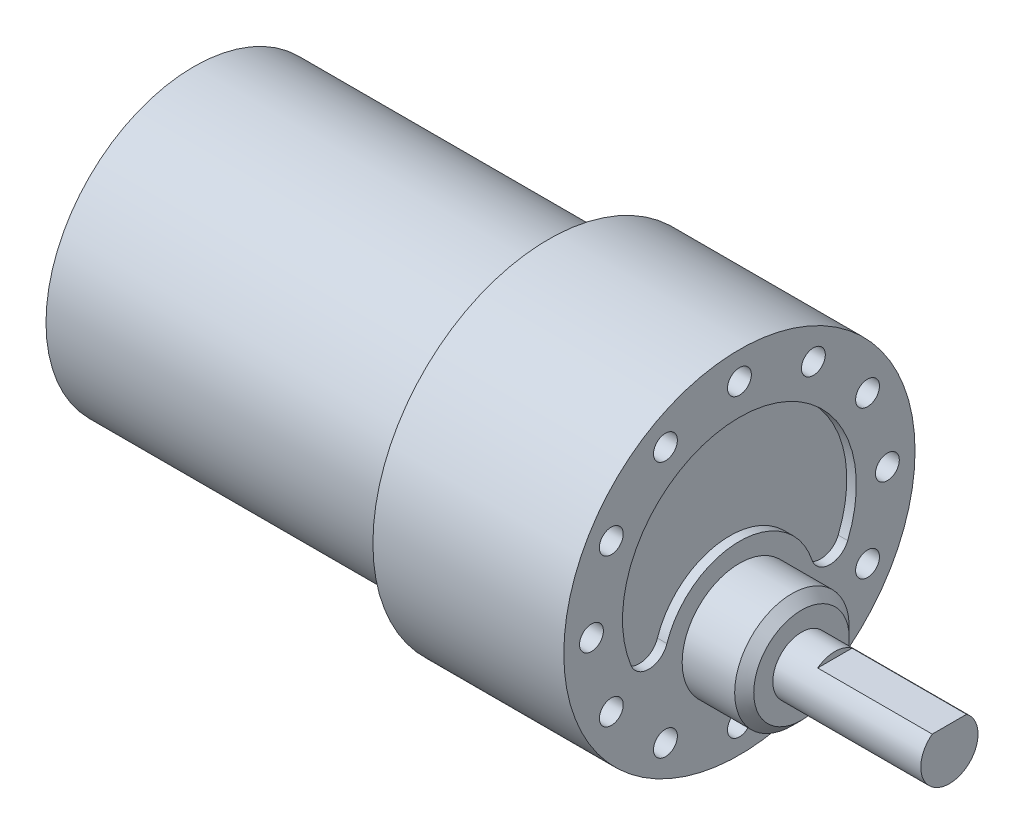
ISO-10303-21;
HEADER;
FILE_DESCRIPTION(('STEP AP214'),'2;1');
FILE_NAME('part.step','',(''),(''),'','','');
FILE_SCHEMA(('AUTOMOTIVE_DESIGN { 1 0 10303 214 1 1 1 1 }'));
ENDSEC;
DATA;
#1=APPLICATION_CONTEXT('core data for automotive mechanical design processes');
#2=APPLICATION_PROTOCOL_DEFINITION('international standard','automotive_design',2000,#1);
#3=PRODUCT_CONTEXT('',#1,'mechanical');
#4=PRODUCT('Part','Part','',(#3));
#5=PRODUCT_RELATED_PRODUCT_CATEGORY('part','',(#4));
#6=PRODUCT_DEFINITION_FORMATION('','',#4);
#7=PRODUCT_DEFINITION_CONTEXT('part definition',#1,'design');
#8=PRODUCT_DEFINITION('design','',#6,#7);
#9=PRODUCT_DEFINITION_SHAPE('','',#8);
#10=(LENGTH_UNIT() NAMED_UNIT(*) SI_UNIT(.MILLI.,.METRE.));
#11=(NAMED_UNIT(*) PLANE_ANGLE_UNIT() SI_UNIT($,.RADIAN.));
#12=(NAMED_UNIT(*) SI_UNIT($,.STERADIAN.) SOLID_ANGLE_UNIT());
#13=UNCERTAINTY_MEASURE_WITH_UNIT(LENGTH_MEASURE(1.E-05),#10,'distance_accuracy_value','');
#14=(GEOMETRIC_REPRESENTATION_CONTEXT(3) GLOBAL_UNCERTAINTY_ASSIGNED_CONTEXT((#13)) GLOBAL_UNIT_ASSIGNED_CONTEXT((#10,
#11,#12)) REPRESENTATION_CONTEXT('',''));
#15=CARTESIAN_POINT('',(0.,0.,0.));
#16=DIRECTION('',(0.,0.,1.));
#17=DIRECTION('',(1.,0.,0.));
#18=AXIS2_PLACEMENT_3D('',#15,#16,#17);
#19=CARTESIAN_POINT('',(6.5,-7.,0.));
#20=DIRECTION('',(-1.,0.,0.));
#21=DIRECTION('',(0.,0.,1.));
#22=AXIS2_PLACEMENT_3D('',#19,#20,#21);
#23=CYLINDRICAL_SURFACE('',#22,6.);
#24=CARTESIAN_POINT('',(5.50000000000004,-7.,0.));
#25=DIRECTION('',(1.,0.,0.));
#26=DIRECTION('',(0.,0.,-1.));
#27=AXIS2_PLACEMENT_3D('',#24,#25,#26);
#28=CIRCLE('',#27,6.);
#29=CARTESIAN_POINT('',(5.50000000000004,-7.,6.));
#30=VERTEX_POINT('',#29);
#31=EDGE_CURVE('E11',#30,#30,#28,.F.);
#32=CARTESIAN_POINT('',(0.,-7.,0.));
#33=DIRECTION('',(1.,0.,0.));
#34=DIRECTION('',(0.,0.,-1.));
#35=AXIS2_PLACEMENT_3D('',#32,#33,#34);
#36=CIRCLE('',#35,6.);
#37=CARTESIAN_POINT('',(0.,-7.,6.));
#38=VERTEX_POINT('',#37);
#39=EDGE_CURVE('E259',#38,#38,#36,.T.);
#40=CARTESIAN_POINT('',(5.50000000000004,-7.,6.));
#41=CARTESIAN_POINT('',(5.44270833333337,-7.,6.));
#42=CARTESIAN_POINT('',(5.3854166666667,-7.,6.));
#43=CARTESIAN_POINT('',(5.27083333333337,-7.,6.));
#44=CARTESIAN_POINT('',(5.2135416666667,-7.,6.));
#45=CARTESIAN_POINT('',(5.09895833333337,-7.,6.));
#46=CARTESIAN_POINT('',(5.0416666666667,-7.,6.));
#47=CARTESIAN_POINT('',(4.92708333333337,-7.,6.));
#48=CARTESIAN_POINT('',(4.8697916666667,-7.,6.));
#49=CARTESIAN_POINT('',(4.75520833333336,-7.,6.));
#50=CARTESIAN_POINT('',(4.6979166666667,-7.,6.));
#51=CARTESIAN_POINT('',(4.58333333333336,-7.,6.));
#52=CARTESIAN_POINT('',(4.5260416666667,-7.,6.));
#53=CARTESIAN_POINT('',(4.41145833333336,-7.,6.));
#54=CARTESIAN_POINT('',(4.35416666666669,-7.,6.));
#55=CARTESIAN_POINT('',(4.23958333333336,-7.,6.));
#56=CARTESIAN_POINT('',(4.18229166666669,-7.,6.));
#57=CARTESIAN_POINT('',(4.06770833333336,-7.,6.));
#58=CARTESIAN_POINT('',(4.01041666666669,-7.,6.));
#59=CARTESIAN_POINT('',(3.89583333333336,-7.,6.));
#60=CARTESIAN_POINT('',(3.83854166666669,-7.,6.));
#61=CARTESIAN_POINT('',(3.72395833333336,-7.,6.));
#62=CARTESIAN_POINT('',(3.66666666666669,-7.,6.));
#63=CARTESIAN_POINT('',(3.55208333333336,-7.,6.));
#64=CARTESIAN_POINT('',(3.49479166666669,-7.,6.));
#65=CARTESIAN_POINT('',(3.38020833333336,-7.,6.));
#66=CARTESIAN_POINT('',(3.32291666666669,-7.,6.));
#67=CARTESIAN_POINT('',(3.20833333333335,-7.,6.));
#68=CARTESIAN_POINT('',(3.15104166666669,-7.,6.));
#69=CARTESIAN_POINT('',(3.03645833333335,-7.,6.));
#70=CARTESIAN_POINT('',(2.97916666666669,-7.,6.));
#71=CARTESIAN_POINT('',(2.86458333333335,-7.,6.));
#72=CARTESIAN_POINT('',(2.80729166666668,-7.,6.));
#73=CARTESIAN_POINT('',(2.69270833333335,-7.,6.));
#74=CARTESIAN_POINT('',(2.63541666666668,-7.,6.));
#75=CARTESIAN_POINT('',(2.52083333333335,-7.,6.));
#76=CARTESIAN_POINT('',(2.46354166666668,-7.,6.));
#77=CARTESIAN_POINT('',(2.34895833333335,-7.,6.));
#78=CARTESIAN_POINT('',(2.29166666666668,-7.,6.));
#79=CARTESIAN_POINT('',(2.17708333333335,-7.,6.));
#80=CARTESIAN_POINT('',(2.11979166666668,-7.,6.));
#81=CARTESIAN_POINT('',(2.00520833333335,-7.,6.));
#82=CARTESIAN_POINT('',(1.94791666666668,-7.,6.));
#83=CARTESIAN_POINT('',(1.83333333333335,-7.,6.));
#84=CARTESIAN_POINT('',(1.77604166666668,-7.,6.));
#85=CARTESIAN_POINT('',(1.66145833333334,-7.,6.));
#86=CARTESIAN_POINT('',(1.60416666666668,-7.,6.));
#87=CARTESIAN_POINT('',(1.48958333333334,-7.,6.));
#88=CARTESIAN_POINT('',(1.43229166666668,-7.,6.));
#89=CARTESIAN_POINT('',(1.31770833333334,-7.,6.));
#90=CARTESIAN_POINT('',(1.26041666666668,-7.,6.));
#91=CARTESIAN_POINT('',(1.14583333333334,-7.,6.));
#92=CARTESIAN_POINT('',(1.08854166666667,-7.,6.));
#93=CARTESIAN_POINT('',(0.97395833333334,-7.,6.));
#94=CARTESIAN_POINT('',(0.916666666666673,-7.,6.));
#95=CARTESIAN_POINT('',(0.802083333333339,-7.,6.));
#96=CARTESIAN_POINT('',(0.744791666666671,-7.,6.));
#97=CARTESIAN_POINT('',(0.630208333333337,-7.,6.));
#98=CARTESIAN_POINT('',(0.57291666666667,-7.,6.));
#99=CARTESIAN_POINT('',(0.458333333333336,-7.,6.));
#100=CARTESIAN_POINT('',(0.401041666666669,-7.,6.));
#101=CARTESIAN_POINT('',(0.286458333333335,-7.,6.));
#102=CARTESIAN_POINT('',(0.229166666666668,-7.,6.));
#103=CARTESIAN_POINT('',(0.114583333333334,-7.,6.));
#104=CARTESIAN_POINT('',(0.057291666666667,-7.,6.));
#105=CARTESIAN_POINT('',(0.,-7.,6.));
#106=B_SPLINE_CURVE_WITH_KNOTS('',3,(#40,#41,#42,#43,#44,#45,#46,#47,#48,#49,#50,#51,#52,#53,
#54,#55,#56,#57,#58,#59,#60,#61,#62,#63,#64,#65,#66,#67,#68,#69,#70,#71,#72,#73,#74,#75,#76,#77,
#78,#79,#80,#81,#82,#83,#84,#85,#86,#87,#88,#89,#90,#91,#92,#93,#94,#95,#96,#97,#98,#99,#100,
#101,#102,#103,#104,#105),.UNSPECIFIED.,.F.,.F.,(4,2,2,2,2,2,2,2,2,2,2,2,2,2,2,2,2,2,2,2,2,2,2,
2,2,2,2,2,2,2,2,2,4),(0.,0.171875000000001,0.343750000000002,0.515625000000003,
0.687500000000004,0.859375000000005,1.03125000000001,1.20312500000001,1.37500000000001,
1.54687500000001,1.71875000000001,1.89062500000001,2.06250000000001,2.23437500000001,
2.40625000000002,2.57812500000002,2.75000000000002,2.92187500000002,3.09375000000002,
3.26562500000002,3.43750000000002,3.60937500000002,3.78125000000002,3.95312500000003,
4.12500000000003,4.29687500000003,4.46875000000003,4.64062500000003,4.81250000000003,
4.98437500000003,5.15625000000003,5.32812500000003,5.50000000000004),.UNSPECIFIED.);
#107=EDGE_CURVE('BSEAM38',#30,#38,#106,.T.);
#108=ORIENTED_EDGE('',*,*,#31,.T.);
#109=ORIENTED_EDGE('',*,*,#39,.T.);
#110=ORIENTED_EDGE('',*,*,#107,.T.);
#111=ORIENTED_EDGE('',*,*,#107,.F.);
#112=EDGE_LOOP('',(#108,#110,#109,#111));
#113=FACE_BOUND('',#112,.T.);
#114=ADVANCED_FACE('F38',(#113),#23,.T.);
#115=CARTESIAN_POINT('',(6.5,0.,0.));
#116=DIRECTION('',(1.,0.,0.));
#117=DIRECTION('',(0.,0.,-1.));
#118=AXIS2_PLACEMENT_3D('',#115,#116,#117);
#119=PLANE('',#118);
#120=CARTESIAN_POINT('',(6.5,-7.,0.));
#121=DIRECTION('',(1.,0.,0.));
#122=DIRECTION('',(0.,0.,-1.));
#123=AXIS2_PLACEMENT_3D('',#120,#121,#122);
#124=CIRCLE('',#123,5.00000000000005);
#125=CARTESIAN_POINT('',(6.5,-7.,-5.00000000000005));
#126=VERTEX_POINT('',#125);
#127=EDGE_CURVE('E46',#126,#126,#124,.T.);
#128=ORIENTED_EDGE('',*,*,#127,.T.);
#129=EDGE_LOOP('',(#128));
#130=FACE_BOUND('',#129,.T.);
#131=CARTESIAN_POINT('',(6.5,-7.,0.));
#132=DIRECTION('',(1.,0.,0.));
#133=DIRECTION('',(0.,0.,-1.));
#134=AXIS2_PLACEMENT_3D('',#131,#132,#133);
#135=CIRCLE('',#134,3.);
#136=CARTESIAN_POINT('',(6.5,-7.,-3.));
#137=VERTEX_POINT('',#136);
#138=EDGE_CURVE('E263',#137,#137,#135,.T.);
#139=ORIENTED_EDGE('',*,*,#138,.F.);
#140=EDGE_LOOP('',(#139));
#141=FACE_BOUND('',#140,.T.);
#142=ADVANCED_FACE('F270',(#130,#141),#119,.T.);
#143=CARTESIAN_POINT('',(22.,-7.,0.));
#144=DIRECTION('',(-1.,0.,0.));
#145=DIRECTION('',(0.,0.,1.));
#146=AXIS2_PLACEMENT_3D('',#143,#144,#145);
#147=CYLINDRICAL_SURFACE('',#146,3.);
#148=CARTESIAN_POINT('',(22.,-7.,0.));
#149=DIRECTION('',(1.,0.,0.));
#150=DIRECTION('',(0.,0.,-1.));
#151=AXIS2_PLACEMENT_3D('',#148,#149,#150);
#152=CIRCLE('',#151,3.);
#153=CARTESIAN_POINT('',(22.,-4.6,1.8));
#154=VERTEX_POINT('',#153);
#155=CARTESIAN_POINT('',(22.,-4.6,-1.8));
#156=VERTEX_POINT('',#155);
#157=EDGE_CURVE('E142',#154,#156,#152,.T.);
#158=ORIENTED_EDGE('',*,*,#157,.F.);
#159=DIRECTION('',(1.,0.,0.));
#160=VECTOR('',#159,1.);
#161=CARTESIAN_POINT('',(10.,-4.6,1.8));
#162=LINE('',#161,#160);
#163=CARTESIAN_POINT('',(10.,-4.6,1.8));
#164=VERTEX_POINT('',#163);
#165=EDGE_CURVE('E53',#164,#154,#162,.T.);
#166=ORIENTED_EDGE('',*,*,#165,.F.);
#167=CARTESIAN_POINT('',(10.,-7.,0.));
#168=DIRECTION('',(1.,0.,0.));
#169=DIRECTION('',(0.,0.,-1.));
#170=AXIS2_PLACEMENT_3D('',#167,#168,#169);
#171=CIRCLE('',#170,3.);
#172=CARTESIAN_POINT('',(10.,-4.6,-1.8));
#173=VERTEX_POINT('',#172);
#174=EDGE_CURVE('E128',#173,#164,#171,.T.);
#175=ORIENTED_EDGE('',*,*,#174,.F.);
#176=DIRECTION('',(1.,0.,0.));
#177=VECTOR('',#176,1.);
#178=CARTESIAN_POINT('',(10.,-4.6,-1.8));
#179=LINE('',#178,#177);
#180=EDGE_CURVE('E136',#173,#156,#179,.T.);
#181=ORIENTED_EDGE('',*,*,#180,.T.);
#182=EDGE_LOOP('',(#158,#166,#175,#181));
#183=FACE_BOUND('',#182,.T.);
#184=ORIENTED_EDGE('',*,*,#138,.T.);
#185=EDGE_LOOP('',(#184));
#186=FACE_BOUND('',#185,.T.);
#187=ADVANCED_FACE('F139',(#183,#186),#147,.T.);
#188=CARTESIAN_POINT('',(22.,0.,0.));
#189=DIRECTION('',(1.,0.,0.));
#190=DIRECTION('',(0.,0.,-1.));
#191=AXIS2_PLACEMENT_3D('',#188,#189,#190);
#192=PLANE('',#191);
#193=DIRECTION('',(0.,0.,-1.));
#194=VECTOR('',#193,1.);
#195=CARTESIAN_POINT('',(22.,-4.6,1.8));
#196=LINE('',#195,#194);
#197=EDGE_CURVE('E133',#154,#156,#196,.T.);
#198=ORIENTED_EDGE('',*,*,#197,.F.);
#199=ORIENTED_EDGE('',*,*,#157,.T.);
#200=EDGE_LOOP('',(#198,#199));
#201=FACE_BOUND('',#200,.T.);
#202=ADVANCED_FACE('F290',(#201),#192,.T.);
#203=CARTESIAN_POINT('',(0.,0.,0.));
#204=DIRECTION('',(1.,0.,0.));
#205=DIRECTION('',(0.,0.,-1.));
#206=AXIS2_PLACEMENT_3D('',#203,#204,#205);
#207=PLANE('',#206);
#208=CARTESIAN_POINT('',(0.,-3.86160714285714,9.49476120153818));
#209=DIRECTION('',(1.,0.,0.));
#210=DIRECTION('',(0.,0.,1.));
#211=AXIS2_PLACEMENT_3D('',#208,#209,#210);
#212=CIRCLE('',#211,2.);
#213=CARTESIAN_POINT('',(0.,-4.61509146341463,11.3473975335456));
#214=VERTEX_POINT('',#213);
#215=CARTESIAN_POINT('',(0.,-4.48928571428572,7.59580896123054));
#216=VERTEX_POINT('',#215);
#217=EDGE_CURVE('E61',#214,#216,#212,.T.);
#218=ORIENTED_EDGE('',*,*,#217,.F.);
#219=CARTESIAN_POINT('',(0.,0.,0.));
#220=DIRECTION('',(1.,0.,0.));
#221=DIRECTION('',(0.,0.,-1.));
#222=AXIS2_PLACEMENT_3D('',#219,#220,#221);
#223=CIRCLE('',#222,12.25);
#224=CARTESIAN_POINT('',(0.,-4.61509146341463,-11.3473975335456));
#225=VERTEX_POINT('',#224);
#226=EDGE_CURVE('E151',#225,#214,#223,.T.);
#227=ORIENTED_EDGE('',*,*,#226,.F.);
#228=CARTESIAN_POINT('',(0.,-3.86160714285714,-9.49476120153818));
#229=DIRECTION('',(1.,0.,0.));
#230=DIRECTION('',(0.,0.,-1.));
#231=AXIS2_PLACEMENT_3D('',#228,#229,#230);
#232=CIRCLE('',#231,2.);
#233=CARTESIAN_POINT('',(0.,-4.48928571428571,-7.59580896123054));
#234=VERTEX_POINT('',#233);
#235=EDGE_CURVE('E165',#234,#225,#232,.T.);
#236=ORIENTED_EDGE('',*,*,#235,.F.);
#237=CARTESIAN_POINT('',(0.,-7.,0.));
#238=DIRECTION('',(-1.,0.,0.));
#239=DIRECTION('',(0.,0.,-1.));
#240=AXIS2_PLACEMENT_3D('',#237,#238,#239);
#241=CIRCLE('',#240,8.);
#242=EDGE_CURVE('E162',#216,#234,#241,.T.);
#243=ORIENTED_EDGE('',*,*,#242,.F.);
#244=EDGE_LOOP('',(#218,#227,#236,#243));
#245=FACE_BOUND('',#244,.T.);
#246=CARTESIAN_POINT('',(0.,7.75000000000006,13.4233937586588));
#247=DIRECTION('',(1.,0.,0.));
#248=DIRECTION('',(0.,0.,-1.));
#249=AXIS2_PLACEMENT_3D('',#246,#247,#248);
#250=CIRCLE('',#249,1.25);
#251=CARTESIAN_POINT('',(0.,7.75000000000006,12.1733937586588));
#252=VERTEX_POINT('',#251);
#253=EDGE_CURVE('E172',#252,#252,#250,.T.);
#254=ORIENTED_EDGE('',*,*,#253,.F.);
#255=EDGE_LOOP('',(#254));
#256=FACE_BOUND('',#255,.T.);
#257=CARTESIAN_POINT('',(0.,0.,15.5));
#258=DIRECTION('',(1.,0.,0.));
#259=DIRECTION('',(0.,0.,-1.));
#260=AXIS2_PLACEMENT_3D('',#257,#258,#259);
#261=CIRCLE('',#260,1.25);
#262=CARTESIAN_POINT('',(0.,0.,14.25));
#263=VERTEX_POINT('',#262);
#264=EDGE_CURVE('E183',#263,#263,#261,.T.);
#265=ORIENTED_EDGE('',*,*,#264,.F.);
#266=EDGE_LOOP('',(#265));
#267=FACE_BOUND('',#266,.T.);
#268=CARTESIAN_POINT('',(0.,-7.75000000000006,13.4233937586588));
#269=DIRECTION('',(1.,0.,0.));
#270=DIRECTION('',(0.,0.,-1.));
#271=AXIS2_PLACEMENT_3D('',#268,#269,#270);
#272=CIRCLE('',#271,1.25);
#273=CARTESIAN_POINT('',(0.,-7.75000000000006,12.1733937586588));
#274=VERTEX_POINT('',#273);
#275=EDGE_CURVE('E189',#274,#274,#272,.T.);
#276=ORIENTED_EDGE('',*,*,#275,.F.);
#277=EDGE_LOOP('',(#276));
#278=FACE_BOUND('',#277,.T.);
#279=CARTESIAN_POINT('',(0.,-13.4233937586588,7.75));
#280=DIRECTION('',(1.,0.,0.));
#281=DIRECTION('',(0.,0.,-1.));
#282=AXIS2_PLACEMENT_3D('',#279,#280,#281);
#283=CIRCLE('',#282,1.25);
#284=CARTESIAN_POINT('',(0.,-13.4233937586588,6.5));
#285=VERTEX_POINT('',#284);
#286=EDGE_CURVE('E195',#285,#285,#283,.T.);
#287=ORIENTED_EDGE('',*,*,#286,.F.);
#288=EDGE_LOOP('',(#287));
#289=FACE_BOUND('',#288,.T.);
#290=CARTESIAN_POINT('',(0.,-15.5,0.));
#291=DIRECTION('',(1.,0.,0.));
#292=DIRECTION('',(0.,0.,-1.));
#293=AXIS2_PLACEMENT_3D('',#290,#291,#292);
#294=CIRCLE('',#293,1.25);
#295=CARTESIAN_POINT('',(0.,-15.5,-1.25));
#296=VERTEX_POINT('',#295);
#297=EDGE_CURVE('E201',#296,#296,#294,.T.);
#298=ORIENTED_EDGE('',*,*,#297,.F.);
#299=EDGE_LOOP('',(#298));
#300=FACE_BOUND('',#299,.T.);
#301=CARTESIAN_POINT('',(0.,-13.4233937586588,-7.75));
#302=DIRECTION('',(1.,0.,0.));
#303=DIRECTION('',(0.,0.,-1.));
#304=AXIS2_PLACEMENT_3D('',#301,#302,#303);
#305=CIRCLE('',#304,1.25);
#306=CARTESIAN_POINT('',(0.,-13.4233937586588,-9.));
#307=VERTEX_POINT('',#306);
#308=EDGE_CURVE('E207',#307,#307,#305,.T.);
#309=ORIENTED_EDGE('',*,*,#308,.F.);
#310=EDGE_LOOP('',(#309));
#311=FACE_BOUND('',#310,.T.);
#312=CARTESIAN_POINT('',(0.,-7.75000000000007,-13.4233937586588));
#313=DIRECTION('',(1.,0.,0.));
#314=DIRECTION('',(0.,0.,-1.));
#315=AXIS2_PLACEMENT_3D('',#312,#313,#314);
#316=CIRCLE('',#315,1.25);
#317=CARTESIAN_POINT('',(0.,-7.75000000000007,-14.6733937586588));
#318=VERTEX_POINT('',#317);
#319=EDGE_CURVE('E213',#318,#318,#316,.T.);
#320=ORIENTED_EDGE('',*,*,#319,.F.);
#321=EDGE_LOOP('',(#320));
#322=FACE_BOUND('',#321,.T.);
#323=CARTESIAN_POINT('',(0.,0.,-15.5));
#324=DIRECTION('',(1.,0.,0.));
#325=DIRECTION('',(0.,0.,-1.));
#326=AXIS2_PLACEMENT_3D('',#323,#324,#325);
#327=CIRCLE('',#326,1.25);
#328=CARTESIAN_POINT('',(0.,0.,-16.75));
#329=VERTEX_POINT('',#328);
#330=EDGE_CURVE('E219',#329,#329,#327,.T.);
#331=ORIENTED_EDGE('',*,*,#330,.F.);
#332=EDGE_LOOP('',(#331));
#333=FACE_BOUND('',#332,.T.);
#334=CARTESIAN_POINT('',(0.,7.75000000000007,-13.4233937586588));
#335=DIRECTION('',(1.,0.,0.));
#336=DIRECTION('',(0.,0.,-1.));
#337=AXIS2_PLACEMENT_3D('',#334,#335,#336);
#338=CIRCLE('',#337,1.25);
#339=CARTESIAN_POINT('',(0.,7.75000000000007,-14.6733937586588));
#340=VERTEX_POINT('',#339);
#341=EDGE_CURVE('E225',#340,#340,#338,.T.);
#342=ORIENTED_EDGE('',*,*,#341,.F.);
#343=EDGE_LOOP('',(#342));
#344=FACE_BOUND('',#343,.T.);
#345=CARTESIAN_POINT('',(0.,13.4233937586588,-7.75));
#346=DIRECTION('',(1.,0.,0.));
#347=DIRECTION('',(0.,0.,-1.));
#348=AXIS2_PLACEMENT_3D('',#345,#346,#347);
#349=CIRCLE('',#348,1.25);
#350=CARTESIAN_POINT('',(0.,13.4233937586588,-9.));
#351=VERTEX_POINT('',#350);
#352=EDGE_CURVE('E231',#351,#351,#349,.T.);
#353=ORIENTED_EDGE('',*,*,#352,.F.);
#354=EDGE_LOOP('',(#353));
#355=FACE_BOUND('',#354,.T.);
#356=CARTESIAN_POINT('',(0.,15.5,0.));
#357=DIRECTION('',(1.,0.,0.));
#358=DIRECTION('',(0.,0.,-1.));
#359=AXIS2_PLACEMENT_3D('',#356,#357,#358);
#360=CIRCLE('',#359,1.25);
#361=CARTESIAN_POINT('',(0.,15.5,-1.25));
#362=VERTEX_POINT('',#361);
#363=EDGE_CURVE('E237',#362,#362,#360,.T.);
#364=ORIENTED_EDGE('',*,*,#363,.F.);
#365=EDGE_LOOP('',(#364));
#366=FACE_BOUND('',#365,.T.);
#367=CARTESIAN_POINT('',(0.,13.4233937586588,7.75));
#368=DIRECTION('',(1.,0.,0.));
#369=DIRECTION('',(0.,0.,-1.));
#370=AXIS2_PLACEMENT_3D('',#367,#368,#369);
#371=CIRCLE('',#370,1.25);
#372=CARTESIAN_POINT('',(0.,13.4233937586588,6.5));
#373=VERTEX_POINT('',#372);
#374=EDGE_CURVE('E243',#373,#373,#371,.T.);
#375=ORIENTED_EDGE('',*,*,#374,.F.);
#376=EDGE_LOOP('',(#375));
#377=FACE_BOUND('',#376,.T.);
#378=ORIENTED_EDGE('',*,*,#39,.F.);
#379=EDGE_LOOP('',(#378));
#380=FACE_BOUND('',#379,.T.);
#381=CARTESIAN_POINT('',(0.,0.,0.));
#382=DIRECTION('',(1.,0.,0.));
#383=DIRECTION('',(0.,0.,-1.));
#384=AXIS2_PLACEMENT_3D('',#381,#382,#383);
#385=CIRCLE('',#384,18.4);
#386=CARTESIAN_POINT('',(0.,0.,-18.4));
#387=VERTEX_POINT('',#386);
#388=EDGE_CURVE('E249',#387,#387,#385,.T.);
#389=ORIENTED_EDGE('',*,*,#388,.T.);
#390=EDGE_LOOP('',(#389));
#391=FACE_BOUND('',#390,.T.);
#392=ADVANCED_FACE('F293',(#245,#256,#267,#278,#289,#300,#311,#322,#333,#344,#355,#366,#377,
#380,#391),#207,.T.);
#393=CARTESIAN_POINT('',(-20.,0.,0.));
#394=DIRECTION('',(1.,0.,0.));
#395=DIRECTION('',(0.,0.,-1.));
#396=AXIS2_PLACEMENT_3D('',#393,#394,#395);
#397=CYLINDRICAL_SURFACE('',#396,18.4);
#398=CARTESIAN_POINT('',(-20.,0.,0.));
#399=DIRECTION('',(1.,0.,0.));
#400=DIRECTION('',(0.,0.,-1.));
#401=AXIS2_PLACEMENT_3D('',#398,#399,#400);
#402=CIRCLE('',#401,18.4);
#403=CARTESIAN_POINT('',(-20.,0.,-18.4));
#404=VERTEX_POINT('',#403);
#405=EDGE_CURVE('E250',#404,#404,#402,.T.);
#406=ORIENTED_EDGE('',*,*,#405,.T.);
#407=EDGE_LOOP('',(#406));
#408=FACE_BOUND('',#407,.T.);
#409=ORIENTED_EDGE('',*,*,#388,.F.);
#410=EDGE_LOOP('',(#409));
#411=FACE_BOUND('',#410,.T.);
#412=ADVANCED_FACE('F303',(#408,#411),#397,.T.);
#413=CARTESIAN_POINT('',(-20.,0.,0.));
#414=DIRECTION('',(1.,0.,0.));
#415=DIRECTION('',(0.,0.,-1.));
#416=AXIS2_PLACEMENT_3D('',#413,#414,#415);
#417=PLANE('',#416);
#418=CARTESIAN_POINT('',(-20.,0.,0.));
#419=DIRECTION('',(1.,0.,0.));
#420=DIRECTION('',(0.,0.,-1.));
#421=AXIS2_PLACEMENT_3D('',#418,#419,#420);
#422=CIRCLE('',#421,15.5);
#423=CARTESIAN_POINT('',(-20.,0.,-15.5));
#424=VERTEX_POINT('',#423);
#425=EDGE_CURVE('E253',#424,#424,#422,.F.);
#426=ORIENTED_EDGE('',*,*,#425,.F.);
#427=EDGE_LOOP('',(#426));
#428=FACE_BOUND('',#427,.T.);
#429=ORIENTED_EDGE('',*,*,#405,.F.);
#430=EDGE_LOOP('',(#429));
#431=FACE_BOUND('',#430,.T.);
#432=ADVANCED_FACE('F307',(#428,#431),#417,.F.);
#433=CARTESIAN_POINT('',(-57.15,0.,0.));
#434=DIRECTION('',(1.,0.,0.));
#435=DIRECTION('',(0.,0.,-1.));
#436=AXIS2_PLACEMENT_3D('',#433,#434,#435);
#437=PLANE('',#436);
#438=CARTESIAN_POINT('',(-57.15,0.,0.));
#439=DIRECTION('',(1.,0.,0.));
#440=DIRECTION('',(0.,0.,-1.));
#441=AXIS2_PLACEMENT_3D('',#438,#439,#440);
#442=CIRCLE('',#441,15.5);
#443=CARTESIAN_POINT('',(-57.15,0.,-15.5));
#444=VERTEX_POINT('',#443);
#445=EDGE_CURVE('E256',#444,#444,#442,.T.);
#446=ORIENTED_EDGE('',*,*,#445,.F.);
#447=EDGE_LOOP('',(#446));
#448=FACE_BOUND('',#447,.T.);
#449=ADVANCED_FACE('F299',(#448),#437,.F.);
#450=CARTESIAN_POINT('',(-57.15,0.,0.));
#451=DIRECTION('',(1.,0.,0.));
#452=DIRECTION('',(0.,0.,-1.));
#453=AXIS2_PLACEMENT_3D('',#450,#451,#452);
#454=CYLINDRICAL_SURFACE('',#453,15.5);
#455=ORIENTED_EDGE('',*,*,#445,.T.);
#456=EDGE_LOOP('',(#455));
#457=FACE_BOUND('',#456,.T.);
#458=ORIENTED_EDGE('',*,*,#425,.T.);
#459=EDGE_LOOP('',(#458));
#460=FACE_BOUND('',#459,.T.);
#461=ADVANCED_FACE('F295',(#457,#460),#454,.T.);
#462=CARTESIAN_POINT('',(-4.675,13.4233937586588,7.75));
#463=DIRECTION('',(1.,0.,0.));
#464=DIRECTION('',(0.,0.,-1.));
#465=AXIS2_PLACEMENT_3D('',#462,#463,#464);
#466=CONICAL_SURFACE('',#465,1.25,1.02974425867665);
#467=CARTESIAN_POINT('',(-5.42607577378445,13.4233937586588,7.75));
#468=VERTEX_POINT('',#467);
#469=VERTEX_LOOP('',#468);
#470=FACE_BOUND('',#469,.T.);
#471=CARTESIAN_POINT('',(-4.675,13.4233937586588,7.75));
#472=DIRECTION('',(1.,0.,0.));
#473=DIRECTION('',(0.,0.,-1.));
#474=AXIS2_PLACEMENT_3D('',#471,#472,#473);
#475=CIRCLE('',#474,1.25);
#476=CARTESIAN_POINT('',(-4.675,13.4233937586588,6.5));
#477=VERTEX_POINT('',#476);
#478=EDGE_CURVE('E246',#477,#477,#475,.T.);
#479=ORIENTED_EDGE('',*,*,#478,.T.);
#480=EDGE_LOOP('',(#479));
#481=FACE_BOUND('',#480,.T.);
#482=ADVANCED_FACE('F298',(#470,#481),#466,.F.);
#483=CARTESIAN_POINT('',(0.,13.4233937586588,7.75));
#484=DIRECTION('',(1.,0.,0.));
#485=DIRECTION('',(0.,0.,-1.));
#486=AXIS2_PLACEMENT_3D('',#483,#484,#485);
#487=CYLINDRICAL_SURFACE('',#486,1.25);
#488=ORIENTED_EDGE('',*,*,#478,.F.);
#489=EDGE_LOOP('',(#488));
#490=FACE_BOUND('',#489,.T.);
#491=ORIENTED_EDGE('',*,*,#374,.T.);
#492=EDGE_LOOP('',(#491));
#493=FACE_BOUND('',#492,.T.);
#494=ADVANCED_FACE('F317',(#490,#493),#487,.F.);
#495=CARTESIAN_POINT('',(-4.675,15.5,0.));
#496=DIRECTION('',(1.,0.,0.));
#497=DIRECTION('',(0.,0.,-1.));
#498=AXIS2_PLACEMENT_3D('',#495,#496,#497);
#499=CONICAL_SURFACE('',#498,1.25,1.02974425867665);
#500=CARTESIAN_POINT('',(-5.42607577378445,15.5,0.));
#501=VERTEX_POINT('',#500);
#502=VERTEX_LOOP('',#501);
#503=FACE_BOUND('',#502,.T.);
#504=CARTESIAN_POINT('',(-4.675,15.5,0.));
#505=DIRECTION('',(1.,0.,0.));
#506=DIRECTION('',(0.,0.,-1.));
#507=AXIS2_PLACEMENT_3D('',#504,#505,#506);
#508=CIRCLE('',#507,1.25);
#509=CARTESIAN_POINT('',(-4.675,15.5,-1.25));
#510=VERTEX_POINT('',#509);
#511=EDGE_CURVE('E240',#510,#510,#508,.T.);
#512=ORIENTED_EDGE('',*,*,#511,.T.);
#513=EDGE_LOOP('',(#512));
#514=FACE_BOUND('',#513,.T.);
#515=ADVANCED_FACE('F321',(#503,#514),#499,.F.);
#516=CARTESIAN_POINT('',(0.,15.5,0.));
#517=DIRECTION('',(1.,0.,0.));
#518=DIRECTION('',(0.,0.,-1.));
#519=AXIS2_PLACEMENT_3D('',#516,#517,#518);
#520=CYLINDRICAL_SURFACE('',#519,1.25);
#521=ORIENTED_EDGE('',*,*,#511,.F.);
#522=EDGE_LOOP('',(#521));
#523=FACE_BOUND('',#522,.T.);
#524=ORIENTED_EDGE('',*,*,#363,.T.);
#525=EDGE_LOOP('',(#524));
#526=FACE_BOUND('',#525,.T.);
#527=ADVANCED_FACE('F325',(#523,#526),#520,.F.);
#528=CARTESIAN_POINT('',(-4.675,13.4233937586588,-7.75));
#529=DIRECTION('',(1.,0.,0.));
#530=DIRECTION('',(0.,0.,-1.));
#531=AXIS2_PLACEMENT_3D('',#528,#529,#530);
#532=CONICAL_SURFACE('',#531,1.25,1.02974425867665);
#533=CARTESIAN_POINT('',(-5.42607577378445,13.4233937586588,-7.75));
#534=VERTEX_POINT('',#533);
#535=VERTEX_LOOP('',#534);
#536=FACE_BOUND('',#535,.T.);
#537=CARTESIAN_POINT('',(-4.675,13.4233937586588,-7.75));
#538=DIRECTION('',(1.,0.,0.));
#539=DIRECTION('',(0.,0.,-1.));
#540=AXIS2_PLACEMENT_3D('',#537,#538,#539);
#541=CIRCLE('',#540,1.25);
#542=CARTESIAN_POINT('',(-4.675,13.4233937586588,-9.));
#543=VERTEX_POINT('',#542);
#544=EDGE_CURVE('E234',#543,#543,#541,.T.);
#545=ORIENTED_EDGE('',*,*,#544,.T.);
#546=EDGE_LOOP('',(#545));
#547=FACE_BOUND('',#546,.T.);
#548=ADVANCED_FACE('F329',(#536,#547),#532,.F.);
#549=CARTESIAN_POINT('',(0.,13.4233937586588,-7.75));
#550=DIRECTION('',(1.,0.,0.));
#551=DIRECTION('',(0.,0.,-1.));
#552=AXIS2_PLACEMENT_3D('',#549,#550,#551);
#553=CYLINDRICAL_SURFACE('',#552,1.25);
#554=ORIENTED_EDGE('',*,*,#544,.F.);
#555=EDGE_LOOP('',(#554));
#556=FACE_BOUND('',#555,.T.);
#557=ORIENTED_EDGE('',*,*,#352,.T.);
#558=EDGE_LOOP('',(#557));
#559=FACE_BOUND('',#558,.T.);
#560=ADVANCED_FACE('F333',(#556,#559),#553,.F.);
#561=CARTESIAN_POINT('',(-4.675,7.75000000000007,-13.4233937586588));
#562=DIRECTION('',(1.,0.,0.));
#563=DIRECTION('',(0.,0.,-1.));
#564=AXIS2_PLACEMENT_3D('',#561,#562,#563);
#565=CONICAL_SURFACE('',#564,1.25,1.02974425867665);
#566=CARTESIAN_POINT('',(-5.42607577378445,7.75000000000007,-13.4233937586588));
#567=VERTEX_POINT('',#566);
#568=VERTEX_LOOP('',#567);
#569=FACE_BOUND('',#568,.T.);
#570=CARTESIAN_POINT('',(-4.675,7.75000000000007,-13.4233937586588));
#571=DIRECTION('',(1.,0.,0.));
#572=DIRECTION('',(0.,0.,-1.));
#573=AXIS2_PLACEMENT_3D('',#570,#571,#572);
#574=CIRCLE('',#573,1.25);
#575=CARTESIAN_POINT('',(-4.675,7.75000000000007,-14.6733937586588));
#576=VERTEX_POINT('',#575);
#577=EDGE_CURVE('E228',#576,#576,#574,.T.);
#578=ORIENTED_EDGE('',*,*,#577,.T.);
#579=EDGE_LOOP('',(#578));
#580=FACE_BOUND('',#579,.T.);
#581=ADVANCED_FACE('F337',(#569,#580),#565,.F.);
#582=CARTESIAN_POINT('',(0.,7.75000000000007,-13.4233937586588));
#583=DIRECTION('',(1.,0.,0.));
#584=DIRECTION('',(0.,0.,-1.));
#585=AXIS2_PLACEMENT_3D('',#582,#583,#584);
#586=CYLINDRICAL_SURFACE('',#585,1.25);
#587=ORIENTED_EDGE('',*,*,#577,.F.);
#588=EDGE_LOOP('',(#587));
#589=FACE_BOUND('',#588,.T.);
#590=ORIENTED_EDGE('',*,*,#341,.T.);
#591=EDGE_LOOP('',(#590));
#592=FACE_BOUND('',#591,.T.);
#593=ADVANCED_FACE('F341',(#589,#592),#586,.F.);
#594=CARTESIAN_POINT('',(-4.675,0.,-15.5));
#595=DIRECTION('',(1.,0.,0.));
#596=DIRECTION('',(0.,0.,-1.));
#597=AXIS2_PLACEMENT_3D('',#594,#595,#596);
#598=CONICAL_SURFACE('',#597,1.25,1.02974425867665);
#599=CARTESIAN_POINT('',(-5.42607577378445,0.,-15.5));
#600=VERTEX_POINT('',#599);
#601=VERTEX_LOOP('',#600);
#602=FACE_BOUND('',#601,.T.);
#603=CARTESIAN_POINT('',(-4.675,0.,-15.5));
#604=DIRECTION('',(1.,0.,0.));
#605=DIRECTION('',(0.,0.,-1.));
#606=AXIS2_PLACEMENT_3D('',#603,#604,#605);
#607=CIRCLE('',#606,1.25);
#608=CARTESIAN_POINT('',(-4.675,0.,-16.75));
#609=VERTEX_POINT('',#608);
#610=EDGE_CURVE('E222',#609,#609,#607,.T.);
#611=ORIENTED_EDGE('',*,*,#610,.T.);
#612=EDGE_LOOP('',(#611));
#613=FACE_BOUND('',#612,.T.);
#614=ADVANCED_FACE('F345',(#602,#613),#598,.F.);
#615=CARTESIAN_POINT('',(0.,0.,-15.5));
#616=DIRECTION('',(1.,0.,0.));
#617=DIRECTION('',(0.,0.,-1.));
#618=AXIS2_PLACEMENT_3D('',#615,#616,#617);
#619=CYLINDRICAL_SURFACE('',#618,1.25);
#620=ORIENTED_EDGE('',*,*,#610,.F.);
#621=EDGE_LOOP('',(#620));
#622=FACE_BOUND('',#621,.T.);
#623=ORIENTED_EDGE('',*,*,#330,.T.);
#624=EDGE_LOOP('',(#623));
#625=FACE_BOUND('',#624,.T.);
#626=ADVANCED_FACE('F349',(#622,#625),#619,.F.);
#627=CARTESIAN_POINT('',(-4.675,-7.75000000000007,-13.4233937586588));
#628=DIRECTION('',(1.,0.,0.));
#629=DIRECTION('',(0.,0.,-1.));
#630=AXIS2_PLACEMENT_3D('',#627,#628,#629);
#631=CONICAL_SURFACE('',#630,1.25,1.02974425867665);
#632=CARTESIAN_POINT('',(-5.42607577378445,-7.75000000000007,-13.4233937586588));
#633=VERTEX_POINT('',#632);
#634=VERTEX_LOOP('',#633);
#635=FACE_BOUND('',#634,.T.);
#636=CARTESIAN_POINT('',(-4.675,-7.75000000000007,-13.4233937586588));
#637=DIRECTION('',(1.,0.,0.));
#638=DIRECTION('',(0.,0.,-1.));
#639=AXIS2_PLACEMENT_3D('',#636,#637,#638);
#640=CIRCLE('',#639,1.25);
#641=CARTESIAN_POINT('',(-4.675,-7.75000000000007,-14.6733937586588));
#642=VERTEX_POINT('',#641);
#643=EDGE_CURVE('E216',#642,#642,#640,.T.);
#644=ORIENTED_EDGE('',*,*,#643,.T.);
#645=EDGE_LOOP('',(#644));
#646=FACE_BOUND('',#645,.T.);
#647=ADVANCED_FACE('F353',(#635,#646),#631,.F.);
#648=CARTESIAN_POINT('',(0.,-7.75000000000007,-13.4233937586588));
#649=DIRECTION('',(1.,0.,0.));
#650=DIRECTION('',(0.,0.,-1.));
#651=AXIS2_PLACEMENT_3D('',#648,#649,#650);
#652=CYLINDRICAL_SURFACE('',#651,1.25);
#653=ORIENTED_EDGE('',*,*,#643,.F.);
#654=EDGE_LOOP('',(#653));
#655=FACE_BOUND('',#654,.T.);
#656=ORIENTED_EDGE('',*,*,#319,.T.);
#657=EDGE_LOOP('',(#656));
#658=FACE_BOUND('',#657,.T.);
#659=ADVANCED_FACE('F357',(#655,#658),#652,.F.);
#660=CARTESIAN_POINT('',(-4.675,-13.4233937586588,-7.75));
#661=DIRECTION('',(1.,0.,0.));
#662=DIRECTION('',(0.,0.,-1.));
#663=AXIS2_PLACEMENT_3D('',#660,#661,#662);
#664=CONICAL_SURFACE('',#663,1.25,1.02974425867665);
#665=CARTESIAN_POINT('',(-5.42607577378445,-13.4233937586588,-7.75));
#666=VERTEX_POINT('',#665);
#667=VERTEX_LOOP('',#666);
#668=FACE_BOUND('',#667,.T.);
#669=CARTESIAN_POINT('',(-4.675,-13.4233937586588,-7.75));
#670=DIRECTION('',(1.,0.,0.));
#671=DIRECTION('',(0.,0.,-1.));
#672=AXIS2_PLACEMENT_3D('',#669,#670,#671);
#673=CIRCLE('',#672,1.25);
#674=CARTESIAN_POINT('',(-4.675,-13.4233937586588,-9.));
#675=VERTEX_POINT('',#674);
#676=EDGE_CURVE('E210',#675,#675,#673,.T.);
#677=ORIENTED_EDGE('',*,*,#676,.T.);
#678=EDGE_LOOP('',(#677));
#679=FACE_BOUND('',#678,.T.);
#680=ADVANCED_FACE('F361',(#668,#679),#664,.F.);
#681=CARTESIAN_POINT('',(0.,-13.4233937586588,-7.75));
#682=DIRECTION('',(1.,0.,0.));
#683=DIRECTION('',(0.,0.,-1.));
#684=AXIS2_PLACEMENT_3D('',#681,#682,#683);
#685=CYLINDRICAL_SURFACE('',#684,1.25);
#686=ORIENTED_EDGE('',*,*,#676,.F.);
#687=EDGE_LOOP('',(#686));
#688=FACE_BOUND('',#687,.T.);
#689=ORIENTED_EDGE('',*,*,#308,.T.);
#690=EDGE_LOOP('',(#689));
#691=FACE_BOUND('',#690,.T.);
#692=ADVANCED_FACE('F365',(#688,#691),#685,.F.);
#693=CARTESIAN_POINT('',(-4.675,-15.5,0.));
#694=DIRECTION('',(1.,0.,0.));
#695=DIRECTION('',(0.,0.,-1.));
#696=AXIS2_PLACEMENT_3D('',#693,#694,#695);
#697=CONICAL_SURFACE('',#696,1.25,1.02974425867665);
#698=CARTESIAN_POINT('',(-5.42607577378445,-15.5,0.));
#699=VERTEX_POINT('',#698);
#700=VERTEX_LOOP('',#699);
#701=FACE_BOUND('',#700,.T.);
#702=CARTESIAN_POINT('',(-4.675,-15.5,0.));
#703=DIRECTION('',(1.,0.,0.));
#704=DIRECTION('',(0.,0.,-1.));
#705=AXIS2_PLACEMENT_3D('',#702,#703,#704);
#706=CIRCLE('',#705,1.25);
#707=CARTESIAN_POINT('',(-4.675,-15.5,-1.25));
#708=VERTEX_POINT('',#707);
#709=EDGE_CURVE('E204',#708,#708,#706,.T.);
#710=ORIENTED_EDGE('',*,*,#709,.T.);
#711=EDGE_LOOP('',(#710));
#712=FACE_BOUND('',#711,.T.);
#713=ADVANCED_FACE('F369',(#701,#712),#697,.F.);
#714=CARTESIAN_POINT('',(0.,-15.5,0.));
#715=DIRECTION('',(1.,0.,0.));
#716=DIRECTION('',(0.,0.,-1.));
#717=AXIS2_PLACEMENT_3D('',#714,#715,#716);
#718=CYLINDRICAL_SURFACE('',#717,1.25);
#719=ORIENTED_EDGE('',*,*,#709,.F.);
#720=EDGE_LOOP('',(#719));
#721=FACE_BOUND('',#720,.T.);
#722=ORIENTED_EDGE('',*,*,#297,.T.);
#723=EDGE_LOOP('',(#722));
#724=FACE_BOUND('',#723,.T.);
#725=ADVANCED_FACE('F373',(#721,#724),#718,.F.);
#726=CARTESIAN_POINT('',(-4.675,-13.4233937586588,7.75));
#727=DIRECTION('',(1.,0.,0.));
#728=DIRECTION('',(0.,0.,-1.));
#729=AXIS2_PLACEMENT_3D('',#726,#727,#728);
#730=CONICAL_SURFACE('',#729,1.25,1.02974425867665);
#731=CARTESIAN_POINT('',(-5.42607577378445,-13.4233937586588,7.75));
#732=VERTEX_POINT('',#731);
#733=VERTEX_LOOP('',#732);
#734=FACE_BOUND('',#733,.T.);
#735=CARTESIAN_POINT('',(-4.675,-13.4233937586588,7.75));
#736=DIRECTION('',(1.,0.,0.));
#737=DIRECTION('',(0.,0.,-1.));
#738=AXIS2_PLACEMENT_3D('',#735,#736,#737);
#739=CIRCLE('',#738,1.25);
#740=CARTESIAN_POINT('',(-4.675,-13.4233937586588,6.5));
#741=VERTEX_POINT('',#740);
#742=EDGE_CURVE('E198',#741,#741,#739,.T.);
#743=ORIENTED_EDGE('',*,*,#742,.T.);
#744=EDGE_LOOP('',(#743));
#745=FACE_BOUND('',#744,.T.);
#746=ADVANCED_FACE('F377',(#734,#745),#730,.F.);
#747=CARTESIAN_POINT('',(0.,-13.4233937586588,7.75));
#748=DIRECTION('',(1.,0.,0.));
#749=DIRECTION('',(0.,0.,-1.));
#750=AXIS2_PLACEMENT_3D('',#747,#748,#749);
#751=CYLINDRICAL_SURFACE('',#750,1.25);
#752=ORIENTED_EDGE('',*,*,#742,.F.);
#753=EDGE_LOOP('',(#752));
#754=FACE_BOUND('',#753,.T.);
#755=ORIENTED_EDGE('',*,*,#286,.T.);
#756=EDGE_LOOP('',(#755));
#757=FACE_BOUND('',#756,.T.);
#758=ADVANCED_FACE('F381',(#754,#757),#751,.F.);
#759=CARTESIAN_POINT('',(-4.675,-7.75000000000006,13.4233937586588));
#760=DIRECTION('',(1.,0.,0.));
#761=DIRECTION('',(0.,0.,-1.));
#762=AXIS2_PLACEMENT_3D('',#759,#760,#761);
#763=CONICAL_SURFACE('',#762,1.25,1.02974425867665);
#764=CARTESIAN_POINT('',(-5.42607577378445,-7.75000000000007,13.4233937586588));
#765=VERTEX_POINT('',#764);
#766=VERTEX_LOOP('',#765);
#767=FACE_BOUND('',#766,.T.);
#768=CARTESIAN_POINT('',(-4.675,-7.75000000000006,13.4233937586588));
#769=DIRECTION('',(1.,0.,0.));
#770=DIRECTION('',(0.,0.,-1.));
#771=AXIS2_PLACEMENT_3D('',#768,#769,#770);
#772=CIRCLE('',#771,1.25);
#773=CARTESIAN_POINT('',(-4.675,-7.75000000000006,12.1733937586588));
#774=VERTEX_POINT('',#773);
#775=EDGE_CURVE('E192',#774,#774,#772,.T.);
#776=ORIENTED_EDGE('',*,*,#775,.T.);
#777=EDGE_LOOP('',(#776));
#778=FACE_BOUND('',#777,.T.);
#779=ADVANCED_FACE('F385',(#767,#778),#763,.F.);
#780=CARTESIAN_POINT('',(0.,-7.75000000000006,13.4233937586588));
#781=DIRECTION('',(1.,0.,0.));
#782=DIRECTION('',(0.,0.,-1.));
#783=AXIS2_PLACEMENT_3D('',#780,#781,#782);
#784=CYLINDRICAL_SURFACE('',#783,1.25);
#785=ORIENTED_EDGE('',*,*,#775,.F.);
#786=EDGE_LOOP('',(#785));
#787=FACE_BOUND('',#786,.T.);
#788=ORIENTED_EDGE('',*,*,#275,.T.);
#789=EDGE_LOOP('',(#788));
#790=FACE_BOUND('',#789,.T.);
#791=ADVANCED_FACE('F389',(#787,#790),#784,.F.);
#792=CARTESIAN_POINT('',(-4.675,0.,15.5));
#793=DIRECTION('',(1.,0.,0.));
#794=DIRECTION('',(0.,0.,-1.));
#795=AXIS2_PLACEMENT_3D('',#792,#793,#794);
#796=CONICAL_SURFACE('',#795,1.25,1.02974425867665);
#797=CARTESIAN_POINT('',(-5.42607577378445,0.,15.5));
#798=VERTEX_POINT('',#797);
#799=VERTEX_LOOP('',#798);
#800=FACE_BOUND('',#799,.T.);
#801=CARTESIAN_POINT('',(-4.675,0.,15.5));
#802=DIRECTION('',(1.,0.,0.));
#803=DIRECTION('',(0.,0.,-1.));
#804=AXIS2_PLACEMENT_3D('',#801,#802,#803);
#805=CIRCLE('',#804,1.25);
#806=CARTESIAN_POINT('',(-4.675,0.,14.25));
#807=VERTEX_POINT('',#806);
#808=EDGE_CURVE('E186',#807,#807,#805,.T.);
#809=ORIENTED_EDGE('',*,*,#808,.T.);
#810=EDGE_LOOP('',(#809));
#811=FACE_BOUND('',#810,.T.);
#812=ADVANCED_FACE('F393',(#800,#811),#796,.F.);
#813=CARTESIAN_POINT('',(0.,0.,15.5));
#814=DIRECTION('',(1.,0.,0.));
#815=DIRECTION('',(0.,0.,-1.));
#816=AXIS2_PLACEMENT_3D('',#813,#814,#815);
#817=CYLINDRICAL_SURFACE('',#816,1.25);
#818=ORIENTED_EDGE('',*,*,#808,.F.);
#819=EDGE_LOOP('',(#818));
#820=FACE_BOUND('',#819,.T.);
#821=ORIENTED_EDGE('',*,*,#264,.T.);
#822=EDGE_LOOP('',(#821));
#823=FACE_BOUND('',#822,.T.);
#824=ADVANCED_FACE('F397',(#820,#823),#817,.F.);
#825=CARTESIAN_POINT('',(-4.675,7.75000000000006,13.4233937586588));
#826=DIRECTION('',(1.,0.,0.));
#827=DIRECTION('',(0.,0.,-1.));
#828=AXIS2_PLACEMENT_3D('',#825,#826,#827);
#829=CONICAL_SURFACE('',#828,1.25,1.02974425867665);
#830=CARTESIAN_POINT('',(-5.42607577378445,7.75000000000006,13.4233937586588));
#831=VERTEX_POINT('',#830);
#832=VERTEX_LOOP('',#831);
#833=FACE_BOUND('',#832,.T.);
#834=CARTESIAN_POINT('',(-4.675,7.75000000000006,13.4233937586588));
#835=DIRECTION('',(1.,0.,0.));
#836=DIRECTION('',(0.,0.,-1.));
#837=AXIS2_PLACEMENT_3D('',#834,#835,#836);
#838=CIRCLE('',#837,1.25);
#839=CARTESIAN_POINT('',(-4.675,7.75000000000006,12.1733937586588));
#840=VERTEX_POINT('',#839);
#841=EDGE_CURVE('E180',#840,#840,#838,.T.);
#842=ORIENTED_EDGE('',*,*,#841,.T.);
#843=EDGE_LOOP('',(#842));
#844=FACE_BOUND('',#843,.T.);
#845=ADVANCED_FACE('F401',(#833,#844),#829,.F.);
#846=CARTESIAN_POINT('',(0.,7.75000000000006,13.4233937586588));
#847=DIRECTION('',(1.,0.,0.));
#848=DIRECTION('',(0.,0.,-1.));
#849=AXIS2_PLACEMENT_3D('',#846,#847,#848);
#850=CYLINDRICAL_SURFACE('',#849,1.25);
#851=ORIENTED_EDGE('',*,*,#841,.F.);
#852=EDGE_LOOP('',(#851));
#853=FACE_BOUND('',#852,.T.);
#854=ORIENTED_EDGE('',*,*,#253,.T.);
#855=EDGE_LOOP('',(#854));
#856=FACE_BOUND('',#855,.T.);
#857=ADVANCED_FACE('F405',(#853,#856),#850,.F.);
#858=CARTESIAN_POINT('',(-1.,-3.86160714285714,9.49476120153818));
#859=DIRECTION('',(1.,0.,0.));
#860=DIRECTION('',(0.,0.,-1.));
#861=AXIS2_PLACEMENT_3D('',#858,#859,#860);
#862=CYLINDRICAL_SURFACE('',#861,2.);
#863=ORIENTED_EDGE('',*,*,#217,.T.);
#864=DIRECTION('',(1.,0.,0.));
#865=VECTOR('',#864,1.);
#866=CARTESIAN_POINT('',(-1.,-4.48928571428572,7.59580896123054));
#867=LINE('',#866,#865);
#868=CARTESIAN_POINT('',(-1.,-4.48928571428572,7.59580896123054));
#869=VERTEX_POINT('',#868);
#870=EDGE_CURVE('E160',#869,#216,#867,.T.);
#871=ORIENTED_EDGE('',*,*,#870,.F.);
#872=CARTESIAN_POINT('',(-1.,-3.86160714285714,9.49476120153818));
#873=DIRECTION('',(1.,0.,0.));
#874=DIRECTION('',(0.,0.,1.));
#875=AXIS2_PLACEMENT_3D('',#872,#873,#874);
#876=CIRCLE('',#875,2.);
#877=CARTESIAN_POINT('',(-1.,-4.61509146341463,11.3473975335456));
#878=VERTEX_POINT('',#877);
#879=EDGE_CURVE('E147',#878,#869,#876,.T.);
#880=ORIENTED_EDGE('',*,*,#879,.F.);
#881=DIRECTION('',(1.,0.,0.));
#882=VECTOR('',#881,1.);
#883=CARTESIAN_POINT('',(-1.,-4.61509146341463,11.3473975335456));
#884=LINE('',#883,#882);
#885=EDGE_CURVE('E170',#878,#214,#884,.T.);
#886=ORIENTED_EDGE('',*,*,#885,.T.);
#887=EDGE_LOOP('',(#863,#871,#880,#886));
#888=FACE_BOUND('',#887,.T.);
#889=ADVANCED_FACE('F409',(#888),#862,.F.);
#890=CARTESIAN_POINT('',(-1.,0.,0.));
#891=DIRECTION('',(1.,0.,0.));
#892=DIRECTION('',(0.,0.,-1.));
#893=AXIS2_PLACEMENT_3D('',#890,#891,#892);
#894=CYLINDRICAL_SURFACE('',#893,12.25);
#895=ORIENTED_EDGE('',*,*,#226,.T.);
#896=ORIENTED_EDGE('',*,*,#885,.F.);
#897=CARTESIAN_POINT('',(-1.,0.,0.));
#898=DIRECTION('',(1.,0.,0.));
#899=DIRECTION('',(0.,0.,-1.));
#900=AXIS2_PLACEMENT_3D('',#897,#898,#899);
#901=CIRCLE('',#900,12.25);
#902=CARTESIAN_POINT('',(-1.,-4.61509146341463,-11.3473975335456));
#903=VERTEX_POINT('',#902);
#904=EDGE_CURVE('E157',#903,#878,#901,.T.);
#905=ORIENTED_EDGE('',*,*,#904,.F.);
#906=DIRECTION('',(1.,0.,0.));
#907=VECTOR('',#906,1.);
#908=CARTESIAN_POINT('',(-1.,-4.61509146341463,-11.3473975335456));
#909=LINE('',#908,#907);
#910=EDGE_CURVE('E173',#903,#225,#909,.T.);
#911=ORIENTED_EDGE('',*,*,#910,.T.);
#912=EDGE_LOOP('',(#895,#896,#905,#911));
#913=FACE_BOUND('',#912,.T.);
#914=ADVANCED_FACE('F413',(#913),#894,.F.);
#915=CARTESIAN_POINT('',(-1.,-3.86160714285714,-9.49476120153818));
#916=DIRECTION('',(1.,0.,0.));
#917=DIRECTION('',(0.,0.,-1.));
#918=AXIS2_PLACEMENT_3D('',#915,#916,#917);
#919=CYLINDRICAL_SURFACE('',#918,2.);
#920=ORIENTED_EDGE('',*,*,#235,.T.);
#921=ORIENTED_EDGE('',*,*,#910,.F.);
#922=CARTESIAN_POINT('',(-1.,-3.86160714285714,-9.49476120153818));
#923=DIRECTION('',(1.,0.,0.));
#924=DIRECTION('',(0.,0.,-1.));
#925=AXIS2_PLACEMENT_3D('',#922,#923,#924);
#926=CIRCLE('',#925,2.);
#927=CARTESIAN_POINT('',(-1.,-4.48928571428571,-7.59580896123054));
#928=VERTEX_POINT('',#927);
#929=EDGE_CURVE('E154',#928,#903,#926,.T.);
#930=ORIENTED_EDGE('',*,*,#929,.F.);
#931=DIRECTION('',(1.,0.,0.));
#932=VECTOR('',#931,1.);
#933=CARTESIAN_POINT('',(-1.,-4.48928571428571,-7.59580896123054));
#934=LINE('',#933,#932);
#935=EDGE_CURVE('E175',#928,#234,#934,.T.);
#936=ORIENTED_EDGE('',*,*,#935,.T.);
#937=EDGE_LOOP('',(#920,#921,#930,#936));
#938=FACE_BOUND('',#937,.T.);
#939=ADVANCED_FACE('F418',(#938),#919,.F.);
#940=CARTESIAN_POINT('',(-1.,-7.,0.));
#941=DIRECTION('',(1.,0.,0.));
#942=DIRECTION('',(0.,0.,-1.));
#943=AXIS2_PLACEMENT_3D('',#940,#941,#942);
#944=CYLINDRICAL_SURFACE('',#943,8.);
#945=ORIENTED_EDGE('',*,*,#242,.T.);
#946=ORIENTED_EDGE('',*,*,#935,.F.);
#947=CARTESIAN_POINT('',(-1.,-7.,0.));
#948=DIRECTION('',(-1.,0.,0.));
#949=DIRECTION('',(0.,0.,-1.));
#950=AXIS2_PLACEMENT_3D('',#947,#948,#949);
#951=CIRCLE('',#950,8.);
#952=EDGE_CURVE('E150',#869,#928,#951,.T.);
#953=ORIENTED_EDGE('',*,*,#952,.F.);
#954=ORIENTED_EDGE('',*,*,#870,.T.);
#955=EDGE_LOOP('',(#945,#946,#953,#954));
#956=FACE_BOUND('',#955,.T.);
#957=ADVANCED_FACE('F414',(#956),#944,.T.);
#958=CARTESIAN_POINT('',(-1.,-1.93080357142857,4.74738060076909));
#959=DIRECTION('',(-1.,0.,0.));
#960=DIRECTION('',(0.,0.,1.));
#961=AXIS2_PLACEMENT_3D('',#958,#959,#960);
#962=PLANE('',#961);
#963=ORIENTED_EDGE('',*,*,#879,.T.);
#964=ORIENTED_EDGE('',*,*,#952,.T.);
#965=ORIENTED_EDGE('',*,*,#929,.T.);
#966=ORIENTED_EDGE('',*,*,#904,.T.);
#967=EDGE_LOOP('',(#963,#964,#965,#966));
#968=FACE_BOUND('',#967,.T.);
#969=ADVANCED_FACE('F417',(#968),#962,.F.);
#970=CARTESIAN_POINT('',(10.,-4.6,1.8));
#971=DIRECTION('',(0.,-1.,0.));
#972=DIRECTION('',(0.,0.,-1.));
#973=AXIS2_PLACEMENT_3D('',#970,#971,#972);
#974=PLANE('',#973);
#975=ORIENTED_EDGE('',*,*,#197,.T.);
#976=ORIENTED_EDGE('',*,*,#180,.F.);
#977=DIRECTION('',(0.,0.,-1.));
#978=VECTOR('',#977,1.);
#979=CARTESIAN_POINT('',(10.,-4.6,1.8));
#980=LINE('',#979,#978);
#981=EDGE_CURVE('E130',#164,#173,#980,.T.);
#982=ORIENTED_EDGE('',*,*,#981,.F.);
#983=ORIENTED_EDGE('',*,*,#165,.T.);
#984=EDGE_LOOP('',(#975,#976,#982,#983));
#985=FACE_BOUND('',#984,.T.);
#986=ADVANCED_FACE('F135',(#985),#974,.F.);
#987=CARTESIAN_POINT('',(10.,-7.,0.));
#988=DIRECTION('',(1.,0.,0.));
#989=DIRECTION('',(0.,0.,-1.));
#990=AXIS2_PLACEMENT_3D('',#987,#988,#989);
#991=PLANE('',#990);
#992=ORIENTED_EDGE('',*,*,#174,.T.);
#993=ORIENTED_EDGE('',*,*,#981,.T.);
#994=EDGE_LOOP('',(#992,#993));
#995=FACE_BOUND('',#994,.T.);
#996=ADVANCED_FACE('F129',(#995),#991,.T.);
#997=CARTESIAN_POINT('',(6.5,-7.,0.));
#998=DIRECTION('',(-1.,0.,0.));
#999=DIRECTION('',(0.,0.,1.));
#1000=AXIS2_PLACEMENT_3D('',#997,#998,#999);
#1001=CONICAL_SURFACE('',#1000,5.00000000000005,0.785398163397444);
#1002=ORIENTED_EDGE('',*,*,#31,.F.);
#1003=EDGE_LOOP('',(#1002));
#1004=FACE_BOUND('',#1003,.T.);
#1005=ORIENTED_EDGE('',*,*,#127,.F.);
#1006=EDGE_LOOP('',(#1005));
#1007=FACE_BOUND('',#1006,.T.);
#1008=ADVANCED_FACE('F40',(#1004,#1007),#1001,.T.);
#1009=CLOSED_SHELL('',(#114,#142,#187,#202,#392,#412,#432,#449,#461,#482,#494,#515,#527,#548,
#560,#581,#593,#614,#626,#647,#659,#680,#692,#713,#725,#746,#758,#779,#791,#812,#824,#845,#857,
#889,#914,#939,#957,#969,#986,#996,#1008));
#1010=MANIFOLD_SOLID_BREP('B2',#1009);
#1011=ADVANCED_BREP_SHAPE_REPRESENTATION('',(#18,#1010),#14);
#1012=SHAPE_DEFINITION_REPRESENTATION(#9,#1011);
ENDSEC;
END-ISO-10303-21;
